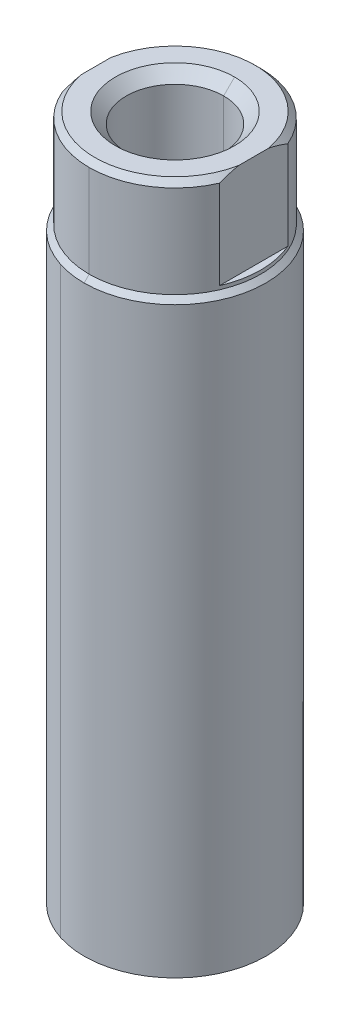
ISO-10303-21;
HEADER;
FILE_DESCRIPTION(('STEP AP214'),'2;1');
FILE_NAME('part.step','',(''),(''),'','','');
FILE_SCHEMA(('AUTOMOTIVE_DESIGN { 1 0 10303 214 1 1 1 1 }'));
ENDSEC;
DATA;
#1=APPLICATION_CONTEXT('core data for automotive mechanical design processes');
#2=APPLICATION_PROTOCOL_DEFINITION('international standard','automotive_design',2000,#1);
#3=PRODUCT_CONTEXT('',#1,'mechanical');
#4=PRODUCT('Part','Part','',(#3));
#5=PRODUCT_RELATED_PRODUCT_CATEGORY('part','',(#4));
#6=PRODUCT_DEFINITION_FORMATION('','',#4);
#7=PRODUCT_DEFINITION_CONTEXT('part definition',#1,'design');
#8=PRODUCT_DEFINITION('design','',#6,#7);
#9=PRODUCT_DEFINITION_SHAPE('','',#8);
#10=(LENGTH_UNIT() NAMED_UNIT(*) SI_UNIT(.MILLI.,.METRE.));
#11=(NAMED_UNIT(*) PLANE_ANGLE_UNIT() SI_UNIT($,.RADIAN.));
#12=(NAMED_UNIT(*) SI_UNIT($,.STERADIAN.) SOLID_ANGLE_UNIT());
#13=UNCERTAINTY_MEASURE_WITH_UNIT(LENGTH_MEASURE(1.E-05),#10,'distance_accuracy_value','');
#14=(GEOMETRIC_REPRESENTATION_CONTEXT(3) GLOBAL_UNCERTAINTY_ASSIGNED_CONTEXT((#13)) GLOBAL_UNIT_ASSIGNED_CONTEXT((#10,
#11,#12)) REPRESENTATION_CONTEXT('',''));
#15=CARTESIAN_POINT('',(0.,0.,0.));
#16=DIRECTION('',(0.,0.,1.));
#17=DIRECTION('',(1.,0.,0.));
#18=AXIS2_PLACEMENT_3D('',#15,#16,#17);
#19=CARTESIAN_POINT('',(0.,23.9776,0.));
#20=DIRECTION('',(0.,-1.,0.));
#21=DIRECTION('',(0.,0.,-1.));
#22=AXIS2_PLACEMENT_3D('',#19,#20,#21);
#23=PLANE('',#22);
#24=CARTESIAN_POINT('',(0.,23.9776,0.));
#25=DIRECTION('',(0.,-1.,0.));
#26=DIRECTION('',(0.,0.,-1.));
#27=AXIS2_PLACEMENT_3D('',#24,#25,#26);
#28=CIRCLE('',#27,2.79738666666658);
#29=CARTESIAN_POINT('',(2.74955,23.9776,0.515118394491957));
#30=VERTEX_POINT('',#29);
#31=CARTESIAN_POINT('',(-2.74955,23.9776,0.515118394491957));
#32=VERTEX_POINT('',#31);
#33=EDGE_CURVE('E11',#30,#32,#28,.T.);
#34=ORIENTED_EDGE('',*,*,#33,.F.);
#35=DIRECTION('',(0.,0.,-1.));
#36=VECTOR('',#35,1.);
#37=CARTESIAN_POINT('',(2.74955,23.9776,6.35));
#38=LINE('',#37,#36);
#39=CARTESIAN_POINT('',(2.74955,23.9776,-0.515118394491957));
#40=VERTEX_POINT('',#39);
#41=EDGE_CURVE('E24',#30,#40,#38,.T.);
#42=ORIENTED_EDGE('',*,*,#41,.T.);
#43=CARTESIAN_POINT('',(0.,23.9776,0.));
#44=DIRECTION('',(0.,-1.,0.));
#45=DIRECTION('',(0.,0.,-1.));
#46=AXIS2_PLACEMENT_3D('',#43,#44,#45);
#47=CIRCLE('',#46,2.79738666666658);
#48=CARTESIAN_POINT('',(-2.74955,23.9776,-0.515118394491957));
#49=VERTEX_POINT('',#48);
#50=EDGE_CURVE('E397',#49,#40,#47,.T.);
#51=ORIENTED_EDGE('',*,*,#50,.F.);
#52=DIRECTION('',(0.,0.,1.));
#53=VECTOR('',#52,1.);
#54=CARTESIAN_POINT('',(-2.74955,23.9776,-6.35));
#55=LINE('',#54,#53);
#56=EDGE_CURVE('E393',#49,#32,#55,.T.);
#57=ORIENTED_EDGE('',*,*,#56,.T.);
#58=EDGE_LOOP('',(#34,#42,#51,#57));
#59=FACE_BOUND('',#58,.T.);
#60=CARTESIAN_POINT('',(0.,23.9776,0.));
#61=DIRECTION('',(0.,1.,0.));
#62=DIRECTION('',(0.,0.,-1.));
#63=AXIS2_PLACEMENT_3D('',#60,#61,#62);
#64=CIRCLE('',#63,2.0828);
#65=CARTESIAN_POINT('',(0.,23.9776,2.0828));
#66=VERTEX_POINT('',#65);
#67=CARTESIAN_POINT('',(0.,23.9776,-2.0828));
#68=VERTEX_POINT('',#67);
#69=EDGE_CURVE('E388',#66,#68,#64,.T.);
#70=ORIENTED_EDGE('',*,*,#69,.F.);
#71=CARTESIAN_POINT('',(0.,23.9776,0.));
#72=DIRECTION('',(0.,1.,0.));
#73=DIRECTION('',(0.,0.,-1.));
#74=AXIS2_PLACEMENT_3D('',#71,#72,#73);
#75=CIRCLE('',#74,2.0828);
#76=EDGE_CURVE('E383',#68,#66,#75,.T.);
#77=ORIENTED_EDGE('',*,*,#76,.F.);
#78=EDGE_LOOP('',(#70,#77));
#79=FACE_BOUND('',#78,.T.);
#80=ADVANCED_FACE('F16',(#59,#79),#23,.F.);
#81=CARTESIAN_POINT('',(0.,23.9776,0.));
#82=DIRECTION('',(0.,1.,0.));
#83=DIRECTION('',(1.,0.,0.));
#84=AXIS2_PLACEMENT_3D('',#81,#82,#83);
#85=CONICAL_SURFACE('',#84,2.0828,0.785398163397452);
#86=DIRECTION('',(0.,0.707106781186544,-0.707106781186551));
#87=VECTOR('',#86,1.);
#88=CARTESIAN_POINT('',(0.,23.59533,-1.70053));
#89=LINE('',#88,#87);
#90=CARTESIAN_POINT('',(0.,23.59533,-1.70053));
#91=VERTEX_POINT('',#90);
#92=EDGE_CURVE('E378',#91,#68,#89,.T.);
#93=ORIENTED_EDGE('',*,*,#92,.T.);
#94=ORIENTED_EDGE('',*,*,#76,.T.);
#95=DIRECTION('',(0.,0.707106781186544,0.707106781186551));
#96=VECTOR('',#95,1.);
#97=CARTESIAN_POINT('',(0.,23.59533,1.70053));
#98=LINE('',#97,#96);
#99=CARTESIAN_POINT('',(0.,23.59533,1.70053));
#100=VERTEX_POINT('',#99);
#101=EDGE_CURVE('E373',#100,#66,#98,.T.);
#102=ORIENTED_EDGE('',*,*,#101,.F.);
#103=CARTESIAN_POINT('',(0.,23.59533,0.));
#104=DIRECTION('',(0.,-1.,0.));
#105=DIRECTION('',(0.,0.,-1.));
#106=AXIS2_PLACEMENT_3D('',#103,#104,#105);
#107=CIRCLE('',#106,1.70053);
#108=EDGE_CURVE('E369',#100,#91,#107,.T.);
#109=ORIENTED_EDGE('',*,*,#108,.T.);
#110=EDGE_LOOP('',(#93,#94,#102,#109));
#111=FACE_BOUND('',#110,.T.);
#112=ADVANCED_FACE('F415',(#111),#85,.F.);
#113=CARTESIAN_POINT('',(0.,9.906,0.));
#114=DIRECTION('',(0.,-1.,0.));
#115=DIRECTION('',(1.,0.,0.));
#116=AXIS2_PLACEMENT_3D('',#113,#114,#115);
#117=CYLINDRICAL_SURFACE('',#116,1.70053);
#118=DIRECTION('',(0.,-1.,0.));
#119=VECTOR('',#118,1.);
#120=CARTESIAN_POINT('',(0.,23.59533,1.70053));
#121=LINE('',#120,#119);
#122=CARTESIAN_POINT('',(0.,10.8878014532651,1.70053));
#123=VERTEX_POINT('',#122);
#124=EDGE_CURVE('E365',#100,#123,#121,.T.);
#125=ORIENTED_EDGE('',*,*,#124,.T.);
#126=CARTESIAN_POINT('',(0.,10.8878014532651,0.));
#127=DIRECTION('',(0.,-1.,0.));
#128=DIRECTION('',(0.,0.,-1.));
#129=AXIS2_PLACEMENT_3D('',#126,#127,#128);
#130=CIRCLE('',#129,1.70053);
#131=CARTESIAN_POINT('',(0.,10.8878014532651,-1.70053));
#132=VERTEX_POINT('',#131);
#133=EDGE_CURVE('E361',#123,#132,#130,.T.);
#134=ORIENTED_EDGE('',*,*,#133,.T.);
#135=DIRECTION('',(0.,-1.,0.));
#136=VECTOR('',#135,1.);
#137=CARTESIAN_POINT('',(0.,23.59533,-1.70053));
#138=LINE('',#137,#136);
#139=EDGE_CURVE('E356',#91,#132,#138,.T.);
#140=ORIENTED_EDGE('',*,*,#139,.F.);
#141=ORIENTED_EDGE('',*,*,#108,.F.);
#142=EDGE_LOOP('',(#125,#134,#140,#141));
#143=FACE_BOUND('',#142,.T.);
#144=ADVANCED_FACE('F419',(#143),#117,.F.);
#145=CARTESIAN_POINT('',(0.,9.906,0.));
#146=DIRECTION('',(0.,-1.,0.));
#147=DIRECTION('',(-1.,0.,0.));
#148=AXIS2_PLACEMENT_3D('',#145,#146,#147);
#149=CYLINDRICAL_SURFACE('',#148,1.70053);
#150=ORIENTED_EDGE('',*,*,#124,.F.);
#151=CARTESIAN_POINT('',(0.,23.59533,0.));
#152=DIRECTION('',(0.,-1.,0.));
#153=DIRECTION('',(0.,0.,-1.));
#154=AXIS2_PLACEMENT_3D('',#151,#152,#153);
#155=CIRCLE('',#154,1.70053);
#156=EDGE_CURVE('E351',#91,#100,#155,.T.);
#157=ORIENTED_EDGE('',*,*,#156,.F.);
#158=ORIENTED_EDGE('',*,*,#139,.T.);
#159=CARTESIAN_POINT('',(0.,10.8878014532651,0.));
#160=DIRECTION('',(0.,-1.,0.));
#161=DIRECTION('',(0.,0.,-1.));
#162=AXIS2_PLACEMENT_3D('',#159,#160,#161);
#163=CIRCLE('',#162,1.70053);
#164=EDGE_CURVE('E346',#132,#123,#163,.T.);
#165=ORIENTED_EDGE('',*,*,#164,.T.);
#166=EDGE_LOOP('',(#150,#157,#158,#165));
#167=FACE_BOUND('',#166,.T.);
#168=ADVANCED_FACE('F424',(#167),#149,.F.);
#169=CARTESIAN_POINT('',(0.,10.8878014532651,0.));
#170=DIRECTION('',(0.,1.,0.));
#171=DIRECTION('',(-1.,0.,0.));
#172=AXIS2_PLACEMENT_3D('',#169,#170,#171);
#173=CONICAL_SURFACE('',#172,1.70053,1.04719755119655);
#174=DIRECTION('',(0.,0.500000000000045,0.866025403784413));
#175=VECTOR('',#174,1.);
#176=CARTESIAN_POINT('',(0.,9.90599999999999,0.));
#177=LINE('',#176,#175);
#178=CARTESIAN_POINT('',(0.,9.90599999999999,0.));
#179=VERTEX_POINT('',#178);
#180=EDGE_CURVE('E341',#179,#123,#177,.T.);
#181=ORIENTED_EDGE('',*,*,#180,.T.);
#182=ORIENTED_EDGE('',*,*,#164,.F.);
#183=DIRECTION('',(0.,0.500000000000045,-0.866025403784413));
#184=VECTOR('',#183,1.);
#185=CARTESIAN_POINT('',(0.,9.90599999999999,0.));
#186=LINE('',#185,#184);
#187=EDGE_CURVE('E338',#179,#132,#186,.T.);
#188=ORIENTED_EDGE('',*,*,#187,.F.);
#189=EDGE_LOOP('',(#181,#182,#188));
#190=FACE_BOUND('',#189,.T.);
#191=ADVANCED_FACE('F430',(#190),#173,.F.);
#192=CARTESIAN_POINT('',(0.,10.8878014532651,0.));
#193=DIRECTION('',(0.,1.,0.));
#194=DIRECTION('',(1.,0.,0.));
#195=AXIS2_PLACEMENT_3D('',#192,#193,#194);
#196=CONICAL_SURFACE('',#195,1.70053,1.04719755119655);
#197=ORIENTED_EDGE('',*,*,#187,.T.);
#198=ORIENTED_EDGE('',*,*,#133,.F.);
#199=ORIENTED_EDGE('',*,*,#180,.F.);
#200=EDGE_LOOP('',(#197,#198,#199));
#201=FACE_BOUND('',#200,.T.);
#202=ADVANCED_FACE('F412',(#201),#196,.F.);
#203=CARTESIAN_POINT('',(0.,23.9776,0.));
#204=DIRECTION('',(0.,1.,0.));
#205=DIRECTION('',(-1.,0.,0.));
#206=AXIS2_PLACEMENT_3D('',#203,#204,#205);
#207=CONICAL_SURFACE('',#206,2.0828,0.785398163397452);
#208=ORIENTED_EDGE('',*,*,#92,.F.);
#209=ORIENTED_EDGE('',*,*,#156,.T.);
#210=ORIENTED_EDGE('',*,*,#101,.T.);
#211=ORIENTED_EDGE('',*,*,#69,.T.);
#212=EDGE_LOOP('',(#208,#209,#210,#211));
#213=FACE_BOUND('',#212,.T.);
#214=ADVANCED_FACE('F407',(#213),#207,.F.);
#215=CARTESIAN_POINT('',(-2.74955,20.6756,-6.35));
#216=DIRECTION('',(-1.,0.,0.));
#217=DIRECTION('',(0.,0.,1.));
#218=AXIS2_PLACEMENT_3D('',#215,#216,#217);
#219=PLANE('',#218);
#220=CARTESIAN_POINT('',(-2.74955,23.9776,-0.515118394491957));
#221=CARTESIAN_POINT('',(-2.74955,23.9457963752007,-0.687830215534324));
#222=CARTESIAN_POINT('',(-2.74955,23.8981446932566,-0.860415922515839));
#223=CARTESIAN_POINT('',(-2.74955,23.8205882154566,-1.08222021437894));
#224=CARTESIAN_POINT('',(-2.74955,23.7997375775249,-1.13782314706192));
#225=CARTESIAN_POINT('',(-2.74955,23.7777866666666,-1.19297218638994));
#226=B_SPLINE_CURVE_WITH_KNOTS('',3,(#220,#221,#222,#223,#224,#225),.UNSPECIFIED.,.F.,.F.,(4,2,
4),(0.,0.747387432738562,1.),.UNSPECIFIED.);
#227=CARTESIAN_POINT('',(-2.74955,23.7777866666666,-1.19297218638994));
#228=VERTEX_POINT('',#227);
#229=EDGE_CURVE('E238',#49,#228,#226,.T.);
#230=ORIENTED_EDGE('',*,*,#229,.T.);
#231=DIRECTION('',(0.,-1.,0.));
#232=VECTOR('',#231,1.);
#233=CARTESIAN_POINT('',(-2.74955,0.,-1.19297218638994));
#234=LINE('',#233,#232);
#235=CARTESIAN_POINT('',(-2.74955,20.6756,-1.19297218638994));
#236=VERTEX_POINT('',#235);
#237=EDGE_CURVE('E323',#228,#236,#234,.T.);
#238=ORIENTED_EDGE('',*,*,#237,.T.);
#239=DIRECTION('',(0.,0.,1.));
#240=VECTOR('',#239,1.);
#241=CARTESIAN_POINT('',(-2.74955,20.6756,-6.35));
#242=LINE('',#241,#240);
#243=CARTESIAN_POINT('',(-2.74955,20.6756,1.19297218638994));
#244=VERTEX_POINT('',#243);
#245=EDGE_CURVE('E319',#236,#244,#242,.T.);
#246=ORIENTED_EDGE('',*,*,#245,.T.);
#247=DIRECTION('',(0.,1.,0.));
#248=VECTOR('',#247,1.);
#249=CARTESIAN_POINT('',(-2.74955,0.,1.19297218638994));
#250=LINE('',#249,#248);
#251=CARTESIAN_POINT('',(-2.74955,23.7777866666666,1.19297218638994));
#252=VERTEX_POINT('',#251);
#253=EDGE_CURVE('E317',#244,#252,#250,.T.);
#254=ORIENTED_EDGE('',*,*,#253,.T.);
#255=CARTESIAN_POINT('',(-2.74955,23.7777866666666,1.19297218638994));
#256=CARTESIAN_POINT('',(-2.74955,23.8646795588023,0.974664182833518));
#257=CARTESIAN_POINT('',(-2.74955,23.9350482437803,0.74619869906836));
#258=CARTESIAN_POINT('',(-2.74955,23.9776,0.515118394491955));
#259=B_SPLINE_CURVE_WITH_KNOTS('',3,(#255,#256,#257,#258),.UNSPECIFIED.,.F.,.F.,(4,4),(0.,1.),.UNSPECIFIED.);
#260=EDGE_CURVE('E306',#252,#32,#259,.T.);
#261=ORIENTED_EDGE('',*,*,#260,.T.);
#262=ORIENTED_EDGE('',*,*,#56,.F.);
#263=EDGE_LOOP('',(#230,#238,#246,#254,#261,#262));
#264=FACE_BOUND('',#263,.T.);
#265=ADVANCED_FACE('F286',(#264),#219,.T.);
#266=CARTESIAN_POINT('',(0.,23.9776,0.));
#267=DIRECTION('',(0.,-1.,0.));
#268=DIRECTION('',(0.,0.,-1.));
#269=AXIS2_PLACEMENT_3D('',#266,#267,#268);
#270=CONICAL_SURFACE('',#269,2.79738666666658,0.785398163397452);
#271=ORIENTED_EDGE('',*,*,#260,.F.);
#272=CARTESIAN_POINT('',(0.,23.7777866666666,0.));
#273=DIRECTION('',(0.,-1.,0.));
#274=DIRECTION('',(0.,0.,-1.));
#275=AXIS2_PLACEMENT_3D('',#272,#273,#274);
#276=CIRCLE('',#275,2.9972);
#277=CARTESIAN_POINT('',(0.,23.7777866666666,2.9972));
#278=VERTEX_POINT('',#277);
#279=EDGE_CURVE('E643',#278,#252,#276,.T.);
#280=ORIENTED_EDGE('',*,*,#279,.F.);
#281=CARTESIAN_POINT('',(0.,23.7777866666666,0.));
#282=DIRECTION('',(0.,-1.,0.));
#283=DIRECTION('',(0.,0.,-1.));
#284=AXIS2_PLACEMENT_3D('',#281,#282,#283);
#285=CIRCLE('',#284,2.9972);
#286=CARTESIAN_POINT('',(2.74955,23.7777866666666,1.19297218638994));
#287=VERTEX_POINT('',#286);
#288=EDGE_CURVE('E652',#287,#278,#285,.T.);
#289=ORIENTED_EDGE('',*,*,#288,.F.);
#290=CARTESIAN_POINT('',(2.74955,23.9776,0.515118394491957));
#291=CARTESIAN_POINT('',(2.74955,23.9457963752007,0.687830215534324));
#292=CARTESIAN_POINT('',(2.74955,23.8981446932566,0.860415922515839));
#293=CARTESIAN_POINT('',(2.74955,23.8205882154566,1.08222021437894));
#294=CARTESIAN_POINT('',(2.74955,23.7997375775249,1.13782314706192));
#295=CARTESIAN_POINT('',(2.74955,23.7777866666666,1.19297218638994));
#296=B_SPLINE_CURVE_WITH_KNOTS('',3,(#290,#291,#292,#293,#294,#295),.UNSPECIFIED.,.F.,.F.,(4,2,
4),(0.,0.747387432738562,1.),.UNSPECIFIED.);
#297=EDGE_CURVE('E260',#30,#287,#296,.T.);
#298=ORIENTED_EDGE('',*,*,#297,.F.);
#299=ORIENTED_EDGE('',*,*,#33,.T.);
#300=EDGE_LOOP('',(#271,#280,#289,#298,#299));
#301=FACE_BOUND('',#300,.T.);
#302=ADVANCED_FACE('F277',(#301),#270,.T.);
#303=CARTESIAN_POINT('',(2.74955,20.6756,6.35));
#304=DIRECTION('',(1.,0.,0.));
#305=DIRECTION('',(0.,0.,-1.));
#306=AXIS2_PLACEMENT_3D('',#303,#304,#305);
#307=PLANE('',#306);
#308=ORIENTED_EDGE('',*,*,#297,.T.);
#309=DIRECTION('',(0.,-1.,0.));
#310=VECTOR('',#309,1.);
#311=CARTESIAN_POINT('',(2.74955,0.,1.19297218638994));
#312=LINE('',#311,#310);
#313=CARTESIAN_POINT('',(2.74955,20.6756,1.19297218638994));
#314=VERTEX_POINT('',#313);
#315=EDGE_CURVE('E256',#287,#314,#312,.T.);
#316=ORIENTED_EDGE('',*,*,#315,.T.);
#317=DIRECTION('',(0.,0.,-1.));
#318=VECTOR('',#317,1.);
#319=CARTESIAN_POINT('',(2.74955,20.6756,6.35));
#320=LINE('',#319,#318);
#321=CARTESIAN_POINT('',(2.74955,20.6756,-1.19297218638994));
#322=VERTEX_POINT('',#321);
#323=EDGE_CURVE('E252',#314,#322,#320,.T.);
#324=ORIENTED_EDGE('',*,*,#323,.T.);
#325=DIRECTION('',(0.,1.,0.));
#326=VECTOR('',#325,1.);
#327=CARTESIAN_POINT('',(2.74955,0.,-1.19297218638994));
#328=LINE('',#327,#326);
#329=CARTESIAN_POINT('',(2.74955,23.7777866666666,-1.19297218638994));
#330=VERTEX_POINT('',#329);
#331=EDGE_CURVE('E250',#322,#330,#328,.T.);
#332=ORIENTED_EDGE('',*,*,#331,.T.);
#333=CARTESIAN_POINT('',(2.74955,23.7777866666666,-1.19297218638994));
#334=CARTESIAN_POINT('',(2.74955,23.8646795588023,-0.974664182833518));
#335=CARTESIAN_POINT('',(2.74955,23.9350482437803,-0.74619869906836));
#336=CARTESIAN_POINT('',(2.74955,23.9776,-0.515118394491955));
#337=B_SPLINE_CURVE_WITH_KNOTS('',3,(#333,#334,#335,#336),.UNSPECIFIED.,.F.,.F.,(4,4),(0.,1.),.UNSPECIFIED.);
#338=EDGE_CURVE('E200',#330,#40,#337,.T.);
#339=ORIENTED_EDGE('',*,*,#338,.T.);
#340=ORIENTED_EDGE('',*,*,#41,.F.);
#341=EDGE_LOOP('',(#308,#316,#324,#332,#339,#340));
#342=FACE_BOUND('',#341,.T.);
#343=ADVANCED_FACE('F220',(#342),#307,.T.);
#344=CARTESIAN_POINT('',(0.,23.9776,0.));
#345=DIRECTION('',(0.,-1.,0.));
#346=DIRECTION('',(0.,0.,1.));
#347=AXIS2_PLACEMENT_3D('',#344,#345,#346);
#348=CONICAL_SURFACE('',#347,2.79738666666658,0.785398163397452);
#349=ORIENTED_EDGE('',*,*,#229,.F.);
#350=ORIENTED_EDGE('',*,*,#50,.T.);
#351=ORIENTED_EDGE('',*,*,#338,.F.);
#352=CARTESIAN_POINT('',(0.,23.7777866666666,0.));
#353=DIRECTION('',(0.,-1.,0.));
#354=DIRECTION('',(0.,0.,-1.));
#355=AXIS2_PLACEMENT_3D('',#352,#353,#354);
#356=CIRCLE('',#355,2.9972);
#357=CARTESIAN_POINT('',(0.,23.7777866666666,-2.9972));
#358=VERTEX_POINT('',#357);
#359=EDGE_CURVE('E195',#358,#330,#356,.T.);
#360=ORIENTED_EDGE('',*,*,#359,.F.);
#361=CARTESIAN_POINT('',(0.,23.7777866666666,0.));
#362=DIRECTION('',(0.,-1.,0.));
#363=DIRECTION('',(0.,0.,-1.));
#364=AXIS2_PLACEMENT_3D('',#361,#362,#363);
#365=CIRCLE('',#364,2.9972);
#366=EDGE_CURVE('E190',#228,#358,#365,.T.);
#367=ORIENTED_EDGE('',*,*,#366,.F.);
#368=EDGE_LOOP('',(#349,#350,#351,#360,#367));
#369=FACE_BOUND('',#368,.T.);
#370=ADVANCED_FACE('F209',(#369),#348,.T.);
#371=CARTESIAN_POINT('',(0.,0.,0.));
#372=DIRECTION('',(0.,-1.,0.));
#373=DIRECTION('',(1.,0.,0.));
#374=AXIS2_PLACEMENT_3D('',#371,#372,#373);
#375=CYLINDRICAL_SURFACE('',#374,2.9972);
#376=DIRECTION('',(0.,-1.,0.));
#377=VECTOR('',#376,1.);
#378=CARTESIAN_POINT('',(0.,23.7777866666666,2.9972));
#379=LINE('',#378,#377);
#380=CARTESIAN_POINT('',(0.,20.5486,2.9972));
#381=VERTEX_POINT('',#380);
#382=EDGE_CURVE('E185',#278,#381,#379,.T.);
#383=ORIENTED_EDGE('',*,*,#382,.F.);
#384=ORIENTED_EDGE('',*,*,#279,.T.);
#385=ORIENTED_EDGE('',*,*,#253,.F.);
#386=CARTESIAN_POINT('',(0.,20.6756,0.));
#387=DIRECTION('',(0.,1.,0.));
#388=DIRECTION('',(0.,0.,1.));
#389=AXIS2_PLACEMENT_3D('',#386,#387,#388);
#390=CIRCLE('',#389,2.9972);
#391=EDGE_CURVE('E180',#236,#244,#390,.T.);
#392=ORIENTED_EDGE('',*,*,#391,.F.);
#393=ORIENTED_EDGE('',*,*,#237,.F.);
#394=ORIENTED_EDGE('',*,*,#366,.T.);
#395=DIRECTION('',(0.,-1.,0.));
#396=VECTOR('',#395,1.);
#397=CARTESIAN_POINT('',(0.,23.7777866666666,-2.9972));
#398=LINE('',#397,#396);
#399=CARTESIAN_POINT('',(0.,20.5486,-2.9972));
#400=VERTEX_POINT('',#399);
#401=EDGE_CURVE('E176',#358,#400,#398,.T.);
#402=ORIENTED_EDGE('',*,*,#401,.T.);
#403=CARTESIAN_POINT('',(0.,20.5486,0.));
#404=DIRECTION('',(0.,-1.,0.));
#405=DIRECTION('',(0.,0.,-1.));
#406=AXIS2_PLACEMENT_3D('',#403,#404,#405);
#407=CIRCLE('',#406,2.9972);
#408=EDGE_CURVE('E171',#381,#400,#407,.T.);
#409=ORIENTED_EDGE('',*,*,#408,.F.);
#410=EDGE_LOOP('',(#383,#384,#385,#392,#393,#394,#402,#409));
#411=FACE_BOUND('',#410,.T.);
#412=ADVANCED_FACE('F219',(#411),#375,.T.);
#413=CARTESIAN_POINT('',(0.,20.5486,0.));
#414=DIRECTION('',(0.,-1.,0.));
#415=DIRECTION('',(1.,0.,0.));
#416=AXIS2_PLACEMENT_3D('',#413,#414,#415);
#417=CONICAL_SURFACE('',#416,2.9972,0.785398163397452);
#418=DIRECTION('',(0.,-0.707106781186545,0.70710678118655));
#419=VECTOR('',#418,1.);
#420=CARTESIAN_POINT('',(0.,20.5486,2.9972));
#421=LINE('',#420,#419);
#422=CARTESIAN_POINT('',(0.,20.3708,3.175));
#423=VERTEX_POINT('',#422);
#424=EDGE_CURVE('E166',#381,#423,#421,.T.);
#425=ORIENTED_EDGE('',*,*,#424,.F.);
#426=ORIENTED_EDGE('',*,*,#408,.T.);
#427=DIRECTION('',(0.,-0.707106781186545,-0.70710678118655));
#428=VECTOR('',#427,1.);
#429=CARTESIAN_POINT('',(0.,20.5486,-2.9972));
#430=LINE('',#429,#428);
#431=CARTESIAN_POINT('',(0.,20.3708,-3.175));
#432=VERTEX_POINT('',#431);
#433=EDGE_CURVE('E162',#400,#432,#430,.T.);
#434=ORIENTED_EDGE('',*,*,#433,.T.);
#435=CARTESIAN_POINT('',(0.,20.3708,0.));
#436=DIRECTION('',(0.,-1.,0.));
#437=DIRECTION('',(0.,0.,-1.));
#438=AXIS2_PLACEMENT_3D('',#435,#436,#437);
#439=CIRCLE('',#438,3.175);
#440=CARTESIAN_POINT('',(-0.981128957140458,20.3708,3.01960443923711));
#441=VERTEX_POINT('',#440);
#442=EDGE_CURVE('E129',#441,#432,#439,.T.);
#443=ORIENTED_EDGE('',*,*,#442,.F.);
#444=CARTESIAN_POINT('',(0.,20.3708,0.));
#445=DIRECTION('',(0.,-1.,0.));
#446=DIRECTION('',(0.,0.,-1.));
#447=AXIS2_PLACEMENT_3D('',#444,#445,#446);
#448=CIRCLE('',#447,3.175);
#449=EDGE_CURVE('E155',#423,#441,#448,.T.);
#450=ORIENTED_EDGE('',*,*,#449,.F.);
#451=EDGE_LOOP('',(#425,#426,#434,#443,#450));
#452=FACE_BOUND('',#451,.T.);
#453=ADVANCED_FACE('F496',(#452),#417,.T.);
#454=CARTESIAN_POINT('',(0.,0.,0.));
#455=DIRECTION('',(0.,-1.,0.));
#456=DIRECTION('',(-0.987688340595138,0.,-0.156434465040231));
#457=AXIS2_PLACEMENT_3D('',#454,#455,#456);
#458=CYLINDRICAL_SURFACE('',#457,3.175);
#459=DIRECTION('',(0.,-1.,0.));
#460=VECTOR('',#459,1.);
#461=CARTESIAN_POINT('',(-0.981128957140458,20.3708,3.01960443923711));
#462=LINE('',#461,#460);
#463=CARTESIAN_POINT('',(-0.981128957140458,0.,3.01960443923711));
#464=VERTEX_POINT('',#463);
#465=EDGE_CURVE('E121',#441,#464,#462,.T.);
#466=ORIENTED_EDGE('',*,*,#465,.T.);
#467=CARTESIAN_POINT('',(0.,0.,0.));
#468=DIRECTION('',(0.,-1.,0.));
#469=DIRECTION('',(0.,0.,-1.));
#470=AXIS2_PLACEMENT_3D('',#467,#468,#469);
#471=CIRCLE('',#470,3.175);
#472=CARTESIAN_POINT('',(0.,0.,-3.175));
#473=VERTEX_POINT('',#472);
#474=EDGE_CURVE('E113',#473,#464,#471,.T.);
#475=ORIENTED_EDGE('',*,*,#474,.F.);
#476=DIRECTION('',(0.,-1.,0.));
#477=VECTOR('',#476,1.);
#478=CARTESIAN_POINT('',(0.,20.3708,-3.175));
#479=LINE('',#478,#477);
#480=EDGE_CURVE('E117',#432,#473,#479,.T.);
#481=ORIENTED_EDGE('',*,*,#480,.F.);
#482=CARTESIAN_POINT('',(0.,20.3708,0.));
#483=DIRECTION('',(0.,-1.,0.));
#484=DIRECTION('',(0.,0.,-1.));
#485=AXIS2_PLACEMENT_3D('',#482,#483,#484);
#486=CIRCLE('',#485,3.175);
#487=EDGE_CURVE('E130',#432,#423,#486,.T.);
#488=ORIENTED_EDGE('',*,*,#487,.T.);
#489=ORIENTED_EDGE('',*,*,#449,.T.);
#490=EDGE_LOOP('',(#466,#475,#481,#488,#489));
#491=FACE_BOUND('',#490,.T.);
#492=ADVANCED_FACE('F115',(#491),#458,.T.);
#493=CARTESIAN_POINT('',(0.,20.5486,0.));
#494=DIRECTION('',(0.,-1.,0.));
#495=DIRECTION('',(-1.,0.,0.));
#496=AXIS2_PLACEMENT_3D('',#493,#494,#495);
#497=CONICAL_SURFACE('',#496,2.9972,0.785398163397452);
#498=ORIENTED_EDGE('',*,*,#424,.T.);
#499=ORIENTED_EDGE('',*,*,#487,.F.);
#500=ORIENTED_EDGE('',*,*,#433,.F.);
#501=CARTESIAN_POINT('',(0.,20.5486,0.));
#502=DIRECTION('',(0.,-1.,0.));
#503=DIRECTION('',(0.,0.,-1.));
#504=AXIS2_PLACEMENT_3D('',#501,#502,#503);
#505=CIRCLE('',#504,2.9972);
#506=EDGE_CURVE('E136',#400,#381,#505,.T.);
#507=ORIENTED_EDGE('',*,*,#506,.T.);
#508=EDGE_LOOP('',(#498,#499,#500,#507));
#509=FACE_BOUND('',#508,.T.);
#510=ADVANCED_FACE('F515',(#509),#497,.T.);
#511=CARTESIAN_POINT('',(0.,0.,0.));
#512=DIRECTION('',(0.,-1.,0.));
#513=DIRECTION('',(-1.,0.,0.));
#514=AXIS2_PLACEMENT_3D('',#511,#512,#513);
#515=CYLINDRICAL_SURFACE('',#514,2.9972);
#516=ORIENTED_EDGE('',*,*,#382,.T.);
#517=ORIENTED_EDGE('',*,*,#506,.F.);
#518=ORIENTED_EDGE('',*,*,#401,.F.);
#519=ORIENTED_EDGE('',*,*,#359,.T.);
#520=ORIENTED_EDGE('',*,*,#331,.F.);
#521=CARTESIAN_POINT('',(0.,20.6756,0.));
#522=DIRECTION('',(0.,1.,0.));
#523=DIRECTION('',(0.,0.,1.));
#524=AXIS2_PLACEMENT_3D('',#521,#522,#523);
#525=CIRCLE('',#524,2.9972);
#526=EDGE_CURVE('E133',#314,#322,#525,.T.);
#527=ORIENTED_EDGE('',*,*,#526,.F.);
#528=ORIENTED_EDGE('',*,*,#315,.F.);
#529=ORIENTED_EDGE('',*,*,#288,.T.);
#530=EDGE_LOOP('',(#516,#517,#518,#519,#520,#527,#528,#529));
#531=FACE_BOUND('',#530,.T.);
#532=ADVANCED_FACE('F525',(#531),#515,.T.);
#533=CARTESIAN_POINT('',(0.,20.6756,0.));
#534=DIRECTION('',(0.,1.,0.));
#535=DIRECTION('',(0.,0.,1.));
#536=AXIS2_PLACEMENT_3D('',#533,#534,#535);
#537=PLANE('',#536);
#538=ORIENTED_EDGE('',*,*,#323,.F.);
#539=ORIENTED_EDGE('',*,*,#526,.T.);
#540=EDGE_LOOP('',(#538,#539));
#541=FACE_BOUND('',#540,.T.);
#542=ADVANCED_FACE('F536',(#541),#537,.T.);
#543=CARTESIAN_POINT('',(0.,0.,0.));
#544=DIRECTION('',(0.,-1.,0.));
#545=DIRECTION('',(0.987688340595138,0.,0.156434465040231));
#546=AXIS2_PLACEMENT_3D('',#543,#544,#545);
#547=CYLINDRICAL_SURFACE('',#546,3.175);
#548=ORIENTED_EDGE('',*,*,#465,.F.);
#549=ORIENTED_EDGE('',*,*,#442,.T.);
#550=ORIENTED_EDGE('',*,*,#480,.T.);
#551=CARTESIAN_POINT('',(0.,0.,0.));
#552=DIRECTION('',(0.,-1.,0.));
#553=DIRECTION('',(0.,0.,-1.));
#554=AXIS2_PLACEMENT_3D('',#551,#552,#553);
#555=CIRCLE('',#554,3.175);
#556=EDGE_CURVE('E128',#464,#473,#555,.T.);
#557=ORIENTED_EDGE('',*,*,#556,.F.);
#558=EDGE_LOOP('',(#548,#549,#550,#557));
#559=FACE_BOUND('',#558,.T.);
#560=ADVANCED_FACE('F127',(#559),#547,.T.);
#561=CARTESIAN_POINT('',(3.175,0.,0.));
#562=DIRECTION('',(0.,1.,0.));
#563=DIRECTION('',(0.,0.,1.));
#564=AXIS2_PLACEMENT_3D('',#561,#562,#563);
#565=PLANE('',#564);
#566=ORIENTED_EDGE('',*,*,#474,.T.);
#567=ORIENTED_EDGE('',*,*,#556,.T.);
#568=EDGE_LOOP('',(#566,#567));
#569=FACE_BOUND('',#568,.T.);
#570=ADVANCED_FACE('F132',(#569),#565,.F.);
#571=CARTESIAN_POINT('',(0.,20.6756,0.));
#572=DIRECTION('',(0.,1.,0.));
#573=DIRECTION('',(0.,0.,1.));
#574=AXIS2_PLACEMENT_3D('',#571,#572,#573);
#575=PLANE('',#574);
#576=ORIENTED_EDGE('',*,*,#391,.T.);
#577=ORIENTED_EDGE('',*,*,#245,.F.);
#578=EDGE_LOOP('',(#576,#577));
#579=FACE_BOUND('',#578,.T.);
#580=ADVANCED_FACE('F566',(#579),#575,.T.);
#581=CLOSED_SHELL('',(#80,#112,#144,#168,#191,#202,#214,#265,#302,#343,#370,#412,#453,#492,#510,
#532,#542,#560,#570,#580));
#582=MANIFOLD_SOLID_BREP('B1',#581);
#583=ADVANCED_BREP_SHAPE_REPRESENTATION('',(#18,#582),#14);
#584=SHAPE_DEFINITION_REPRESENTATION(#9,#583);
ENDSEC;
END-ISO-10303-21;
